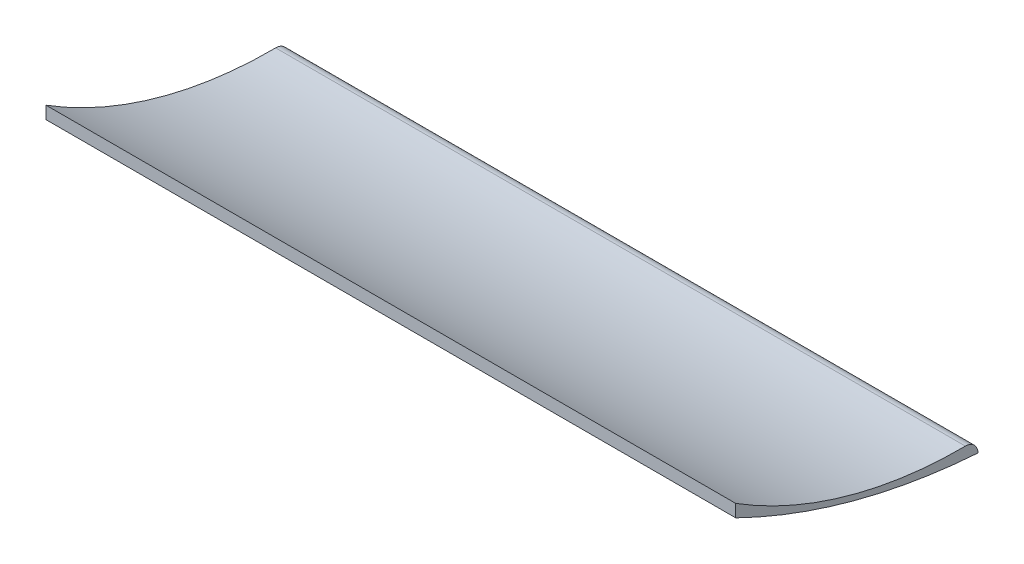
ISO-10303-21;
HEADER;
FILE_DESCRIPTION(('STEP AP214'),'2;1');
FILE_NAME('part.step','',(''),(''),'','','');
FILE_SCHEMA(('AUTOMOTIVE_DESIGN { 1 0 10303 214 1 1 1 1 }'));
ENDSEC;
DATA;
#1=APPLICATION_CONTEXT('core data for automotive mechanical design processes');
#2=APPLICATION_PROTOCOL_DEFINITION('international standard','automotive_design',2000,#1);
#3=PRODUCT_CONTEXT('',#1,'mechanical');
#4=PRODUCT('Part','Part','',(#3));
#5=PRODUCT_RELATED_PRODUCT_CATEGORY('part','',(#4));
#6=PRODUCT_DEFINITION_FORMATION('','',#4);
#7=PRODUCT_DEFINITION_CONTEXT('part definition',#1,'design');
#8=PRODUCT_DEFINITION('design','',#6,#7);
#9=PRODUCT_DEFINITION_SHAPE('','',#8);
#10=(LENGTH_UNIT() NAMED_UNIT(*) SI_UNIT(.MILLI.,.METRE.));
#11=(NAMED_UNIT(*) PLANE_ANGLE_UNIT() SI_UNIT($,.RADIAN.));
#12=(NAMED_UNIT(*) SI_UNIT($,.STERADIAN.) SOLID_ANGLE_UNIT());
#13=UNCERTAINTY_MEASURE_WITH_UNIT(LENGTH_MEASURE(1.E-05),#10,'distance_accuracy_value','');
#14=(GEOMETRIC_REPRESENTATION_CONTEXT(3) GLOBAL_UNCERTAINTY_ASSIGNED_CONTEXT((#13)) GLOBAL_UNIT_ASSIGNED_CONTEXT((#10,
#11,#12)) REPRESENTATION_CONTEXT('',''));
#15=CARTESIAN_POINT('',(0.,0.,0.));
#16=DIRECTION('',(0.,0.,1.));
#17=DIRECTION('',(1.,0.,0.));
#18=AXIS2_PLACEMENT_3D('',#15,#16,#17);
#19=CARTESIAN_POINT('',(550.,467.02428085643,-228.666396942215));
#20=DIRECTION('',(-1.,0.,0.));
#21=DIRECTION('',(0.,0.,1.));
#22=AXIS2_PLACEMENT_3D('',#19,#20,#21);
#23=CYLINDRICAL_SURFACE('',#22,520.);
#24=CARTESIAN_POINT('',(0.,467.02428085643,-228.666396942215));
#25=DIRECTION('',(1.,0.,0.));
#26=DIRECTION('',(0.,0.,-1.));
#27=AXIS2_PLACEMENT_3D('',#24,#25,#26);
#28=CIRCLE('',#27,520.);
#29=CARTESIAN_POINT('',(0.,0.,0.));
#30=VERTEX_POINT('',#29);
#31=CARTESIAN_POINT('',(0.,-51.7638090205043,-193.185165257814));
#32=VERTEX_POINT('',#31);
#33=EDGE_CURVE('E86',#30,#32,#28,.T.);
#34=ORIENTED_EDGE('',*,*,#33,.T.);
#35=DIRECTION('',(-1.,0.,0.));
#36=VECTOR('',#35,1.);
#37=CARTESIAN_POINT('',(550.,-51.7638090205043,-193.185165257814));
#38=LINE('',#37,#36);
#39=CARTESIAN_POINT('',(550.,-51.7638090205043,-193.185165257814));
#40=VERTEX_POINT('',#39);
#41=EDGE_CURVE('E84',#40,#32,#38,.T.);
#42=ORIENTED_EDGE('',*,*,#41,.F.);
#43=CARTESIAN_POINT('',(550.,467.02428085643,-228.666396942215));
#44=DIRECTION('',(1.,0.,0.));
#45=DIRECTION('',(0.,0.,-1.));
#46=AXIS2_PLACEMENT_3D('',#43,#44,#45);
#47=CIRCLE('',#46,520.);
#48=CARTESIAN_POINT('',(550.,0.,0.));
#49=VERTEX_POINT('',#48);
#50=EDGE_CURVE('E72',#49,#40,#47,.T.);
#51=ORIENTED_EDGE('',*,*,#50,.F.);
#52=DIRECTION('',(-1.,0.,0.));
#53=VECTOR('',#52,1.);
#54=CARTESIAN_POINT('',(550.,0.,0.));
#55=LINE('',#54,#53);
#56=EDGE_CURVE('E96',#49,#30,#55,.T.);
#57=ORIENTED_EDGE('',*,*,#56,.T.);
#58=EDGE_LOOP('',(#34,#42,#51,#57));
#59=FACE_BOUND('',#58,.T.);
#60=ADVANCED_FACE('F35',(#59),#23,.T.);
#61=CARTESIAN_POINT('',(550.,298.006835841832,-180.69881711947));
#62=DIRECTION('',(-1.,0.,0.));
#63=DIRECTION('',(0.,0.,1.));
#64=AXIS2_PLACEMENT_3D('',#61,#62,#63);
#65=CYLINDRICAL_SURFACE('',#64,340.);
#66=CARTESIAN_POINT('',(550.,298.006835841832,-180.69881711947));
#67=DIRECTION('',(-1.,0.,0.));
#68=DIRECTION('',(0.,0.,-1.));
#69=AXIS2_PLACEMENT_3D('',#66,#67,#68);
#70=CIRCLE('',#69,340.);
#71=CARTESIAN_POINT('',(550.,-41.9845682613237,-183.116488719252));
#72=VERTEX_POINT('',#71);
#73=CARTESIAN_POINT('',(550.,10.,0.));
#74=VERTEX_POINT('',#73);
#75=EDGE_CURVE('E80',#72,#74,#70,.T.);
#76=ORIENTED_EDGE('',*,*,#75,.F.);
#77=DIRECTION('',(-1.,0.,0.));
#78=VECTOR('',#77,1.);
#79=CARTESIAN_POINT('',(550.,-41.9845682613237,-183.116488719252));
#80=LINE('',#79,#78);
#81=CARTESIAN_POINT('',(0.,-41.9845682613237,-183.116488719252));
#82=VERTEX_POINT('',#81);
#83=EDGE_CURVE('E87',#72,#82,#80,.T.);
#84=ORIENTED_EDGE('',*,*,#83,.T.);
#85=CARTESIAN_POINT('',(0.,298.006835841832,-180.69881711947));
#86=DIRECTION('',(-1.,0.,0.));
#87=DIRECTION('',(0.,0.,-1.));
#88=AXIS2_PLACEMENT_3D('',#85,#86,#87);
#89=CIRCLE('',#88,340.);
#90=CARTESIAN_POINT('',(0.,10.,0.));
#91=VERTEX_POINT('',#90);
#92=EDGE_CURVE('E99',#82,#91,#89,.T.);
#93=ORIENTED_EDGE('',*,*,#92,.T.);
#94=DIRECTION('',(-1.,0.,0.));
#95=VECTOR('',#94,1.);
#96=CARTESIAN_POINT('',(550.,10.,0.));
#97=LINE('',#96,#95);
#98=EDGE_CURVE('E88',#74,#91,#97,.T.);
#99=ORIENTED_EDGE('',*,*,#98,.F.);
#100=EDGE_LOOP('',(#76,#84,#93,#99));
#101=FACE_BOUND('',#100,.T.);
#102=ADVANCED_FACE('F104',(#101),#65,.F.);
#103=CARTESIAN_POINT('',(550.,10.,0.));
#104=DIRECTION('',(0.,0.,-1.));
#105=DIRECTION('',(0.,1.,0.));
#106=AXIS2_PLACEMENT_3D('',#103,#104,#105);
#107=PLANE('',#106);
#108=DIRECTION('',(0.,-1.,0.));
#109=VECTOR('',#108,1.);
#110=CARTESIAN_POINT('',(0.,10.,0.));
#111=LINE('',#110,#109);
#112=EDGE_CURVE('E81',#91,#30,#111,.T.);
#113=ORIENTED_EDGE('',*,*,#112,.T.);
#114=ORIENTED_EDGE('',*,*,#56,.F.);
#115=DIRECTION('',(0.,-1.,0.));
#116=VECTOR('',#115,1.);
#117=CARTESIAN_POINT('',(550.,10.,0.));
#118=LINE('',#117,#116);
#119=EDGE_CURVE('E76',#74,#49,#118,.T.);
#120=ORIENTED_EDGE('',*,*,#119,.F.);
#121=ORIENTED_EDGE('',*,*,#98,.T.);
#122=EDGE_LOOP('',(#113,#114,#120,#121));
#123=FACE_BOUND('',#122,.T.);
#124=ADVANCED_FACE('F107',(#123),#107,.F.);
#125=CARTESIAN_POINT('',(550.,467.02428085643,-228.666396942215));
#126=DIRECTION('',(1.,0.,0.));
#127=DIRECTION('',(0.,0.,-1.));
#128=AXIS2_PLACEMENT_3D('',#125,#126,#127);
#129=PLANE('',#128);
#130=ORIENTED_EDGE('',*,*,#50,.T.);
#131=CARTESIAN_POINT('',(550.,-51.9843154408283,-183.187596707481));
#132=DIRECTION('',(1.,0.,0.));
#133=DIRECTION('',(0.,0.,-1.));
#134=AXIS2_PLACEMENT_3D('',#131,#132,#133);
#135=CIRCLE('',#134,10.);
#136=EDGE_CURVE('E11',#40,#72,#135,.T.);
#137=ORIENTED_EDGE('',*,*,#136,.T.);
#138=ORIENTED_EDGE('',*,*,#75,.T.);
#139=ORIENTED_EDGE('',*,*,#119,.T.);
#140=EDGE_LOOP('',(#130,#137,#138,#139));
#141=FACE_BOUND('',#140,.T.);
#142=ADVANCED_FACE('F74',(#141),#129,.T.);
#143=CARTESIAN_POINT('',(0.,467.02428085643,-228.666396942215));
#144=DIRECTION('',(1.,0.,0.));
#145=DIRECTION('',(0.,0.,-1.));
#146=AXIS2_PLACEMENT_3D('',#143,#144,#145);
#147=PLANE('',#146);
#148=ORIENTED_EDGE('',*,*,#92,.F.);
#149=CARTESIAN_POINT('',(0.,-51.9843154408283,-183.187596707481));
#150=DIRECTION('',(1.,0.,0.));
#151=DIRECTION('',(0.,0.,-1.));
#152=AXIS2_PLACEMENT_3D('',#149,#150,#151);
#153=CIRCLE('',#152,10.);
#154=EDGE_CURVE('E43',#82,#32,#153,.F.);
#155=ORIENTED_EDGE('',*,*,#154,.T.);
#156=ORIENTED_EDGE('',*,*,#33,.F.);
#157=ORIENTED_EDGE('',*,*,#112,.F.);
#158=EDGE_LOOP('',(#148,#155,#156,#157));
#159=FACE_BOUND('',#158,.T.);
#160=ADVANCED_FACE('F109',(#159),#147,.F.);
#161=CARTESIAN_POINT('',(550.,-51.9843154408283,-183.187596707481));
#162=DIRECTION('',(-1.,0.,0.));
#163=DIRECTION('',(0.,0.,1.));
#164=AXIS2_PLACEMENT_3D('',#161,#162,#163);
#165=CYLINDRICAL_SURFACE('',#164,10.);
#166=ORIENTED_EDGE('',*,*,#136,.F.);
#167=ORIENTED_EDGE('',*,*,#41,.T.);
#168=ORIENTED_EDGE('',*,*,#154,.F.);
#169=ORIENTED_EDGE('',*,*,#83,.F.);
#170=EDGE_LOOP('',(#166,#167,#168,#169));
#171=FACE_BOUND('',#170,.T.);
#172=ADVANCED_FACE('F37',(#171),#165,.T.);
#173=CLOSED_SHELL('',(#60,#102,#124,#142,#160,#172));
#174=MANIFOLD_SOLID_BREP('B2',#173);
#175=ADVANCED_BREP_SHAPE_REPRESENTATION('',(#18,#174),#14);
#176=SHAPE_DEFINITION_REPRESENTATION(#9,#175);
ENDSEC;
END-ISO-10303-21;
